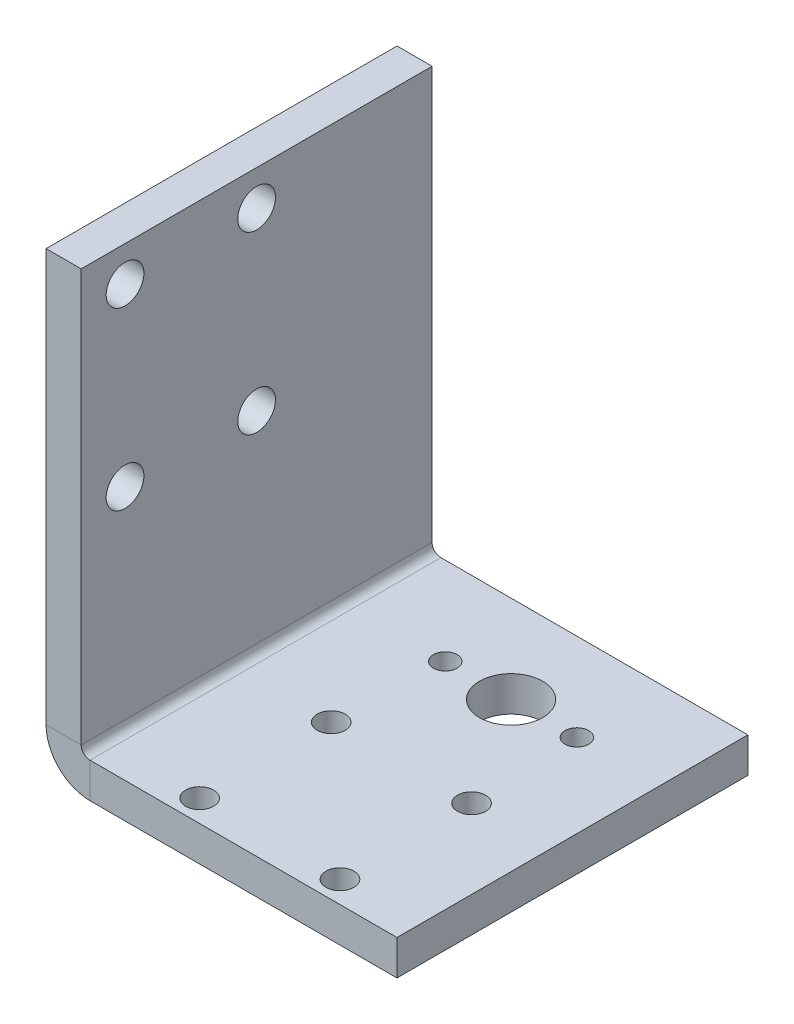
ISO-10303-21;
HEADER;
FILE_DESCRIPTION(('STEP AP214'),'2;1');
FILE_NAME('part.step','',(''),(''),'','','');
FILE_SCHEMA(('AUTOMOTIVE_DESIGN { 1 0 10303 214 1 1 1 1 }'));
ENDSEC;
DATA;
#1=APPLICATION_CONTEXT('core data for automotive mechanical design processes');
#2=APPLICATION_PROTOCOL_DEFINITION('international standard','automotive_design',2000,#1);
#3=PRODUCT_CONTEXT('',#1,'mechanical');
#4=PRODUCT('Part','Part','',(#3));
#5=PRODUCT_RELATED_PRODUCT_CATEGORY('part','',(#4));
#6=PRODUCT_DEFINITION_FORMATION('','',#4);
#7=PRODUCT_DEFINITION_CONTEXT('part definition',#1,'design');
#8=PRODUCT_DEFINITION('design','',#6,#7);
#9=PRODUCT_DEFINITION_SHAPE('','',#8);
#10=(LENGTH_UNIT() NAMED_UNIT(*) SI_UNIT(.MILLI.,.METRE.));
#11=(NAMED_UNIT(*) PLANE_ANGLE_UNIT() SI_UNIT($,.RADIAN.));
#12=(NAMED_UNIT(*) SI_UNIT($,.STERADIAN.) SOLID_ANGLE_UNIT());
#13=UNCERTAINTY_MEASURE_WITH_UNIT(LENGTH_MEASURE(1.E-05),#10,'distance_accuracy_value','');
#14=(GEOMETRIC_REPRESENTATION_CONTEXT(3) GLOBAL_UNCERTAINTY_ASSIGNED_CONTEXT((#13)) GLOBAL_UNIT_ASSIGNED_CONTEXT((#10,
#11,#12)) REPRESENTATION_CONTEXT('',''));
#15=CARTESIAN_POINT('',(0.,0.,0.));
#16=DIRECTION('',(0.,0.,1.));
#17=DIRECTION('',(1.,0.,0.));
#18=AXIS2_PLACEMENT_3D('',#15,#16,#17);
#19=CARTESIAN_POINT('',(1.,0.,20.));
#20=DIRECTION('',(0.,0.,1.));
#21=DIRECTION('',(1.,0.,0.));
#22=AXIS2_PLACEMENT_3D('',#19,#20,#21);
#23=PLANE('',#22);
#24=DIRECTION('',(0.,-1.,0.));
#25=VECTOR('',#24,1.);
#26=CARTESIAN_POINT('',(1.,0.,20.));
#27=LINE('',#26,#25);
#28=CARTESIAN_POINT('',(1.,0.,20.));
#29=VERTEX_POINT('',#28);
#30=CARTESIAN_POINT('',(1.,-4.,20.));
#31=VERTEX_POINT('',#30);
#32=EDGE_CURVE('E11',#29,#31,#27,.T.);
#33=ORIENTED_EDGE('',*,*,#32,.F.);
#34=CARTESIAN_POINT('',(1.,1.,20.));
#35=DIRECTION('',(0.,0.,-1.));
#36=DIRECTION('',(-1.,0.,0.));
#37=AXIS2_PLACEMENT_3D('',#34,#35,#36);
#38=CIRCLE('',#37,1.);
#39=CARTESIAN_POINT('',(0.,1.,20.));
#40=VERTEX_POINT('',#39);
#41=EDGE_CURVE('E137',#40,#29,#38,.F.);
#42=ORIENTED_EDGE('',*,*,#41,.F.);
#43=DIRECTION('',(1.,0.,0.));
#44=VECTOR('',#43,1.);
#45=CARTESIAN_POINT('',(-4.,1.,20.));
#46=LINE('',#45,#44);
#47=CARTESIAN_POINT('',(-4.,1.,20.));
#48=VERTEX_POINT('',#47);
#49=EDGE_CURVE('E48',#48,#40,#46,.T.);
#50=ORIENTED_EDGE('',*,*,#49,.F.);
#51=CARTESIAN_POINT('',(1.,1.,20.));
#52=DIRECTION('',(0.,0.,1.));
#53=DIRECTION('',(1.,0.,0.));
#54=AXIS2_PLACEMENT_3D('',#51,#52,#53);
#55=CIRCLE('',#54,5.);
#56=EDGE_CURVE('E130',#48,#31,#55,.T.);
#57=ORIENTED_EDGE('',*,*,#56,.T.);
#58=EDGE_LOOP('',(#33,#42,#50,#57));
#59=FACE_BOUND('',#58,.T.);
#60=ADVANCED_FACE('F39',(#59),#23,.T.);
#61=CARTESIAN_POINT('',(-4.,1.,20.));
#62=DIRECTION('',(0.,0.,1.));
#63=DIRECTION('',(1.,0.,0.));
#64=AXIS2_PLACEMENT_3D('',#61,#62,#63);
#65=PLANE('',#64);
#66=DIRECTION('',(1.,0.,0.));
#67=VECTOR('',#66,1.);
#68=CARTESIAN_POINT('',(0.,0.,20.));
#69=LINE('',#68,#67);
#70=CARTESIAN_POINT('',(36.,0.,20.));
#71=VERTEX_POINT('',#70);
#72=EDGE_CURVE('E188',#29,#71,#69,.T.);
#73=ORIENTED_EDGE('',*,*,#72,.F.);
#74=ORIENTED_EDGE('',*,*,#32,.T.);
#75=DIRECTION('',(1.,0.,0.));
#76=VECTOR('',#75,1.);
#77=CARTESIAN_POINT('',(0.,-4.,20.));
#78=LINE('',#77,#76);
#79=CARTESIAN_POINT('',(36.,-4.,20.));
#80=VERTEX_POINT('',#79);
#81=EDGE_CURVE('E96',#31,#80,#78,.T.);
#82=ORIENTED_EDGE('',*,*,#81,.T.);
#83=DIRECTION('',(0.,-1.,0.));
#84=VECTOR('',#83,1.);
#85=CARTESIAN_POINT('',(36.,0.,20.));
#86=LINE('',#85,#84);
#87=EDGE_CURVE('E505',#71,#80,#86,.T.);
#88=ORIENTED_EDGE('',*,*,#87,.F.);
#89=EDGE_LOOP('',(#73,#74,#82,#88));
#90=FACE_BOUND('',#89,.T.);
#91=ADVANCED_FACE('F196',(#90),#65,.T.);
#92=CARTESIAN_POINT('',(0.,1.,-20.));
#93=DIRECTION('',(0.,0.,-1.));
#94=DIRECTION('',(-1.,0.,0.));
#95=AXIS2_PLACEMENT_3D('',#92,#93,#94);
#96=PLANE('',#95);
#97=DIRECTION('',(-1.,0.,0.));
#98=VECTOR('',#97,1.);
#99=CARTESIAN_POINT('',(0.,1.,-20.));
#100=LINE('',#99,#98);
#101=CARTESIAN_POINT('',(0.,1.,-20.));
#102=VERTEX_POINT('',#101);
#103=CARTESIAN_POINT('',(-4.,1.,-20.));
#104=VERTEX_POINT('',#103);
#105=EDGE_CURVE('E83',#102,#104,#100,.T.);
#106=ORIENTED_EDGE('',*,*,#105,.F.);
#107=CARTESIAN_POINT('',(1.,1.,-20.));
#108=DIRECTION('',(0.,0.,-1.));
#109=DIRECTION('',(-1.,0.,0.));
#110=AXIS2_PLACEMENT_3D('',#107,#108,#109);
#111=CIRCLE('',#110,1.);
#112=CARTESIAN_POINT('',(1.,0.,-20.));
#113=VERTEX_POINT('',#112);
#114=EDGE_CURVE('E153',#102,#113,#111,.F.);
#115=ORIENTED_EDGE('',*,*,#114,.T.);
#116=DIRECTION('',(0.,1.,0.));
#117=VECTOR('',#116,1.);
#118=CARTESIAN_POINT('',(1.,-4.,-20.));
#119=LINE('',#118,#117);
#120=CARTESIAN_POINT('',(1.,-4.,-20.));
#121=VERTEX_POINT('',#120);
#122=EDGE_CURVE('E90',#121,#113,#119,.T.);
#123=ORIENTED_EDGE('',*,*,#122,.F.);
#124=CARTESIAN_POINT('',(1.,1.,-20.));
#125=DIRECTION('',(0.,0.,1.));
#126=DIRECTION('',(1.,0.,0.));
#127=AXIS2_PLACEMENT_3D('',#124,#125,#126);
#128=CIRCLE('',#127,5.);
#129=EDGE_CURVE('E160',#104,#121,#128,.T.);
#130=ORIENTED_EDGE('',*,*,#129,.F.);
#131=EDGE_LOOP('',(#106,#115,#123,#130));
#132=FACE_BOUND('',#131,.T.);
#133=ADVANCED_FACE('F194',(#132),#96,.T.);
#134=CARTESIAN_POINT('',(1.,-4.,-20.));
#135=DIRECTION('',(0.,0.,-1.));
#136=DIRECTION('',(-1.,0.,0.));
#137=AXIS2_PLACEMENT_3D('',#134,#135,#136);
#138=PLANE('',#137);
#139=DIRECTION('',(0.,-1.,0.));
#140=VECTOR('',#139,1.);
#141=CARTESIAN_POINT('',(0.,0.,-20.));
#142=LINE('',#141,#140);
#143=CARTESIAN_POINT('',(0.,48.,-20.));
#144=VERTEX_POINT('',#143);
#145=EDGE_CURVE('E155',#144,#102,#142,.T.);
#146=ORIENTED_EDGE('',*,*,#145,.T.);
#147=ORIENTED_EDGE('',*,*,#105,.T.);
#148=DIRECTION('',(0.,1.,0.));
#149=VECTOR('',#148,1.);
#150=CARTESIAN_POINT('',(-4.,0.,-20.));
#151=LINE('',#150,#149);
#152=CARTESIAN_POINT('',(-4.,48.,-20.));
#153=VERTEX_POINT('',#152);
#154=EDGE_CURVE('E158',#153,#104,#151,.F.);
#155=ORIENTED_EDGE('',*,*,#154,.F.);
#156=DIRECTION('',(1.,0.,0.));
#157=VECTOR('',#156,1.);
#158=CARTESIAN_POINT('',(-4.,48.,-20.));
#159=LINE('',#158,#157);
#160=EDGE_CURVE('E118',#153,#144,#159,.T.);
#161=ORIENTED_EDGE('',*,*,#160,.T.);
#162=EDGE_LOOP('',(#146,#147,#155,#161));
#163=FACE_BOUND('',#162,.T.);
#164=ADVANCED_FACE('F190',(#163),#138,.T.);
#165=CARTESIAN_POINT('',(0.,-4.,20.));
#166=DIRECTION('',(0.,1.,0.));
#167=DIRECTION('',(0.,0.,1.));
#168=AXIS2_PLACEMENT_3D('',#165,#166,#167);
#169=PLANE('',#168);
#170=CARTESIAN_POINT('',(11.5,-4.,-10.));
#171=DIRECTION('',(0.,-1.,0.));
#172=DIRECTION('',(0.,0.,-1.));
#173=AXIS2_PLACEMENT_3D('',#170,#171,#172);
#174=CIRCLE('',#173,1.35);
#175=CARTESIAN_POINT('',(11.5,-4.,-11.35));
#176=VERTEX_POINT('',#175);
#177=EDGE_CURVE('E444',#176,#176,#174,.T.);
#178=ORIENTED_EDGE('',*,*,#177,.F.);
#179=EDGE_LOOP('',(#178));
#180=FACE_BOUND('',#179,.T.);
#181=CARTESIAN_POINT('',(26.5,-4.,-10.));
#182=DIRECTION('',(0.,-1.,0.));
#183=DIRECTION('',(0.,0.,-1.));
#184=AXIS2_PLACEMENT_3D('',#181,#182,#183);
#185=CIRCLE('',#184,1.34999999999999);
#186=CARTESIAN_POINT('',(26.5,-4.,-11.35));
#187=VERTEX_POINT('',#186);
#188=EDGE_CURVE('E446',#187,#187,#185,.T.);
#189=ORIENTED_EDGE('',*,*,#188,.F.);
#190=EDGE_LOOP('',(#189));
#191=FACE_BOUND('',#190,.T.);
#192=CARTESIAN_POINT('',(19.,-4.,-10.));
#193=DIRECTION('',(0.,-1.,0.));
#194=DIRECTION('',(0.,0.,-1.));
#195=AXIS2_PLACEMENT_3D('',#192,#193,#194);
#196=CIRCLE('',#195,3.6);
#197=CARTESIAN_POINT('',(19.,-4.,-13.6));
#198=VERTEX_POINT('',#197);
#199=EDGE_CURVE('E478',#198,#198,#196,.T.);
#200=ORIENTED_EDGE('',*,*,#199,.F.);
#201=EDGE_LOOP('',(#200));
#202=FACE_BOUND('',#201,.T.);
#203=CARTESIAN_POINT('',(27.,-4.,17.5));
#204=DIRECTION('',(0.,1.,0.));
#205=DIRECTION('',(0.,0.,1.));
#206=AXIS2_PLACEMENT_3D('',#203,#204,#205);
#207=CIRCLE('',#206,1.59999999999999);
#208=CARTESIAN_POINT('',(27.,-4.,19.1));
#209=VERTEX_POINT('',#208);
#210=EDGE_CURVE('E484',#209,#209,#207,.T.);
#211=ORIENTED_EDGE('',*,*,#210,.T.);
#212=EDGE_LOOP('',(#211));
#213=FACE_BOUND('',#212,.T.);
#214=CARTESIAN_POINT('',(11.,-4.,2.5));
#215=DIRECTION('',(0.,1.,0.));
#216=DIRECTION('',(0.,0.,1.));
#217=AXIS2_PLACEMENT_3D('',#214,#215,#216);
#218=CIRCLE('',#217,1.59999999999999);
#219=CARTESIAN_POINT('',(11.,-4.,4.09999999999999));
#220=VERTEX_POINT('',#219);
#221=EDGE_CURVE('E490',#220,#220,#218,.T.);
#222=ORIENTED_EDGE('',*,*,#221,.T.);
#223=EDGE_LOOP('',(#222));
#224=FACE_BOUND('',#223,.T.);
#225=CARTESIAN_POINT('',(11.,-4.,17.5));
#226=DIRECTION('',(0.,1.,0.));
#227=DIRECTION('',(0.,0.,1.));
#228=AXIS2_PLACEMENT_3D('',#225,#226,#227);
#229=CIRCLE('',#228,1.59999999999999);
#230=CARTESIAN_POINT('',(11.,-4.,19.1));
#231=VERTEX_POINT('',#230);
#232=EDGE_CURVE('E496',#231,#231,#229,.T.);
#233=ORIENTED_EDGE('',*,*,#232,.T.);
#234=EDGE_LOOP('',(#233));
#235=FACE_BOUND('',#234,.T.);
#236=CARTESIAN_POINT('',(27.,-4.,2.5));
#237=DIRECTION('',(0.,1.,0.));
#238=DIRECTION('',(0.,0.,1.));
#239=AXIS2_PLACEMENT_3D('',#236,#237,#238);
#240=CIRCLE('',#239,1.59999999999999);
#241=CARTESIAN_POINT('',(27.,-4.,4.09999999999999));
#242=VERTEX_POINT('',#241);
#243=EDGE_CURVE('E147',#242,#242,#240,.T.);
#244=ORIENTED_EDGE('',*,*,#243,.T.);
#245=EDGE_LOOP('',(#244));
#246=FACE_BOUND('',#245,.T.);
#247=DIRECTION('',(1.,0.,0.));
#248=VECTOR('',#247,1.);
#249=CARTESIAN_POINT('',(0.,-4.,-20.));
#250=LINE('',#249,#248);
#251=CARTESIAN_POINT('',(36.,-4.,-20.));
#252=VERTEX_POINT('',#251);
#253=EDGE_CURVE('E143',#121,#252,#250,.T.);
#254=ORIENTED_EDGE('',*,*,#253,.T.);
#255=DIRECTION('',(0.,0.,-1.));
#256=VECTOR('',#255,1.);
#257=CARTESIAN_POINT('',(36.,-4.,20.));
#258=LINE('',#257,#256);
#259=EDGE_CURVE('E174',#80,#252,#258,.T.);
#260=ORIENTED_EDGE('',*,*,#259,.F.);
#261=ORIENTED_EDGE('',*,*,#81,.F.);
#262=DIRECTION('',(0.,0.,-1.));
#263=VECTOR('',#262,1.);
#264=CARTESIAN_POINT('',(1.,-4.,20.));
#265=LINE('',#264,#263);
#266=EDGE_CURVE('E142',#31,#121,#265,.T.);
#267=ORIENTED_EDGE('',*,*,#266,.T.);
#268=EDGE_LOOP('',(#254,#260,#261,#267));
#269=FACE_BOUND('',#268,.T.);
#270=ADVANCED_FACE('F202',(#180,#191,#202,#213,#224,#235,#246,#269),#169,.F.);
#271=CARTESIAN_POINT('',(36.,0.,20.));
#272=DIRECTION('',(1.,0.,0.));
#273=DIRECTION('',(0.,0.,-1.));
#274=AXIS2_PLACEMENT_3D('',#271,#272,#273);
#275=PLANE('',#274);
#276=DIRECTION('',(0.,-1.,0.));
#277=VECTOR('',#276,1.);
#278=CARTESIAN_POINT('',(36.,0.,-20.));
#279=LINE('',#278,#277);
#280=CARTESIAN_POINT('',(36.,0.,-20.));
#281=VERTEX_POINT('',#280);
#282=EDGE_CURVE('E146',#281,#252,#279,.T.);
#283=ORIENTED_EDGE('',*,*,#282,.F.);
#284=DIRECTION('',(0.,0.,-1.));
#285=VECTOR('',#284,1.);
#286=CARTESIAN_POINT('',(36.,0.,20.));
#287=LINE('',#286,#285);
#288=EDGE_CURVE('E172',#71,#281,#287,.T.);
#289=ORIENTED_EDGE('',*,*,#288,.F.);
#290=ORIENTED_EDGE('',*,*,#87,.T.);
#291=ORIENTED_EDGE('',*,*,#259,.T.);
#292=EDGE_LOOP('',(#283,#289,#290,#291));
#293=FACE_BOUND('',#292,.T.);
#294=ADVANCED_FACE('F231',(#293),#275,.T.);
#295=CARTESIAN_POINT('',(0.,0.,20.));
#296=DIRECTION('',(0.,1.,0.));
#297=DIRECTION('',(0.,0.,1.));
#298=AXIS2_PLACEMENT_3D('',#295,#296,#297);
#299=PLANE('',#298);
#300=CARTESIAN_POINT('',(11.5,0.,-10.));
#301=DIRECTION('',(0.,1.,0.));
#302=DIRECTION('',(0.,0.,1.));
#303=AXIS2_PLACEMENT_3D('',#300,#301,#302);
#304=CIRCLE('',#303,1.34999999999999);
#305=CARTESIAN_POINT('',(11.5,0.,-8.65000000000001));
#306=VERTEX_POINT('',#305);
#307=EDGE_CURVE('E441',#306,#306,#304,.T.);
#308=ORIENTED_EDGE('',*,*,#307,.F.);
#309=EDGE_LOOP('',(#308));
#310=FACE_BOUND('',#309,.T.);
#311=CARTESIAN_POINT('',(26.5,0.,-10.));
#312=DIRECTION('',(0.,1.,0.));
#313=DIRECTION('',(0.,0.,1.));
#314=AXIS2_PLACEMENT_3D('',#311,#312,#313);
#315=CIRCLE('',#314,1.34999999999999);
#316=CARTESIAN_POINT('',(26.5,0.,-8.65000000000001));
#317=VERTEX_POINT('',#316);
#318=EDGE_CURVE('E451',#317,#317,#315,.T.);
#319=ORIENTED_EDGE('',*,*,#318,.F.);
#320=EDGE_LOOP('',(#319));
#321=FACE_BOUND('',#320,.T.);
#322=CARTESIAN_POINT('',(19.,0.,-10.));
#323=DIRECTION('',(0.,1.,0.));
#324=DIRECTION('',(0.,0.,1.));
#325=AXIS2_PLACEMENT_3D('',#322,#323,#324);
#326=CIRCLE('',#325,3.6);
#327=CARTESIAN_POINT('',(19.,0.,-6.4));
#328=VERTEX_POINT('',#327);
#329=EDGE_CURVE('E42',#328,#328,#326,.T.);
#330=ORIENTED_EDGE('',*,*,#329,.F.);
#331=EDGE_LOOP('',(#330));
#332=FACE_BOUND('',#331,.T.);
#333=CARTESIAN_POINT('',(27.,0.,17.5));
#334=DIRECTION('',(0.,1.,0.));
#335=DIRECTION('',(0.,0.,1.));
#336=AXIS2_PLACEMENT_3D('',#333,#334,#335);
#337=CIRCLE('',#336,1.59999999999999);
#338=CARTESIAN_POINT('',(27.,0.,19.1));
#339=VERTEX_POINT('',#338);
#340=EDGE_CURVE('E481',#339,#339,#337,.T.);
#341=ORIENTED_EDGE('',*,*,#340,.F.);
#342=EDGE_LOOP('',(#341));
#343=FACE_BOUND('',#342,.T.);
#344=CARTESIAN_POINT('',(11.,0.,2.5));
#345=DIRECTION('',(0.,1.,0.));
#346=DIRECTION('',(0.,0.,1.));
#347=AXIS2_PLACEMENT_3D('',#344,#345,#346);
#348=CIRCLE('',#347,1.59999999999999);
#349=CARTESIAN_POINT('',(11.,0.,4.09999999999998));
#350=VERTEX_POINT('',#349);
#351=EDGE_CURVE('E487',#350,#350,#348,.T.);
#352=ORIENTED_EDGE('',*,*,#351,.F.);
#353=EDGE_LOOP('',(#352));
#354=FACE_BOUND('',#353,.T.);
#355=CARTESIAN_POINT('',(11.,0.,17.5));
#356=DIRECTION('',(0.,1.,0.));
#357=DIRECTION('',(0.,0.,1.));
#358=AXIS2_PLACEMENT_3D('',#355,#356,#357);
#359=CIRCLE('',#358,1.59999999999999);
#360=CARTESIAN_POINT('',(11.,0.,19.1));
#361=VERTEX_POINT('',#360);
#362=EDGE_CURVE('E493',#361,#361,#359,.T.);
#363=ORIENTED_EDGE('',*,*,#362,.F.);
#364=EDGE_LOOP('',(#363));
#365=FACE_BOUND('',#364,.T.);
#366=CARTESIAN_POINT('',(27.,0.,2.5));
#367=DIRECTION('',(0.,1.,0.));
#368=DIRECTION('',(0.,0.,1.));
#369=AXIS2_PLACEMENT_3D('',#366,#367,#368);
#370=CIRCLE('',#369,1.59999999999999);
#371=CARTESIAN_POINT('',(27.,0.,4.09999999999999));
#372=VERTEX_POINT('',#371);
#373=EDGE_CURVE('E499',#372,#372,#370,.T.);
#374=ORIENTED_EDGE('',*,*,#373,.F.);
#375=EDGE_LOOP('',(#374));
#376=FACE_BOUND('',#375,.T.);
#377=DIRECTION('',(1.,0.,0.));
#378=VECTOR('',#377,1.);
#379=CARTESIAN_POINT('',(0.,0.,-20.));
#380=LINE('',#379,#378);
#381=EDGE_CURVE('E150',#113,#281,#380,.T.);
#382=ORIENTED_EDGE('',*,*,#381,.F.);
#383=DIRECTION('',(0.,0.,-1.));
#384=VECTOR('',#383,1.);
#385=CARTESIAN_POINT('',(1.,0.,20.));
#386=LINE('',#385,#384);
#387=EDGE_CURVE('E169',#29,#113,#386,.T.);
#388=ORIENTED_EDGE('',*,*,#387,.F.);
#389=ORIENTED_EDGE('',*,*,#72,.T.);
#390=ORIENTED_EDGE('',*,*,#288,.T.);
#391=EDGE_LOOP('',(#382,#388,#389,#390));
#392=FACE_BOUND('',#391,.T.);
#393=ADVANCED_FACE('F236',(#310,#321,#332,#343,#354,#365,#376,#392),#299,.T.);
#394=CARTESIAN_POINT('',(1.,1.,20.));
#395=DIRECTION('',(0.,0.,-1.));
#396=DIRECTION('',(-1.,0.,0.));
#397=AXIS2_PLACEMENT_3D('',#394,#395,#396);
#398=CYLINDRICAL_SURFACE('',#397,1.);
#399=ORIENTED_EDGE('',*,*,#114,.F.);
#400=DIRECTION('',(0.,0.,-1.));
#401=VECTOR('',#400,1.);
#402=CARTESIAN_POINT('',(0.,1.,20.));
#403=LINE('',#402,#401);
#404=EDGE_CURVE('E166',#40,#102,#403,.T.);
#405=ORIENTED_EDGE('',*,*,#404,.F.);
#406=ORIENTED_EDGE('',*,*,#41,.T.);
#407=ORIENTED_EDGE('',*,*,#387,.T.);
#408=EDGE_LOOP('',(#399,#405,#406,#407));
#409=FACE_BOUND('',#408,.T.);
#410=ADVANCED_FACE('F184',(#409),#398,.F.);
#411=CARTESIAN_POINT('',(0.,0.,20.));
#412=DIRECTION('',(1.,0.,0.));
#413=DIRECTION('',(0.,0.,-1.));
#414=AXIS2_PLACEMENT_3D('',#411,#412,#413);
#415=PLANE('',#414);
#416=CARTESIAN_POINT('',(0.,44.,15.));
#417=DIRECTION('',(1.,0.,0.));
#418=DIRECTION('',(0.,0.,-1.));
#419=AXIS2_PLACEMENT_3D('',#416,#417,#418);
#420=CIRCLE('',#419,2.14999999999999);
#421=CARTESIAN_POINT('',(0.,44.,12.85));
#422=VERTEX_POINT('',#421);
#423=EDGE_CURVE('E454',#422,#422,#420,.T.);
#424=ORIENTED_EDGE('',*,*,#423,.F.);
#425=EDGE_LOOP('',(#424));
#426=FACE_BOUND('',#425,.T.);
#427=CARTESIAN_POINT('',(0.,24.,15.));
#428=DIRECTION('',(1.,0.,0.));
#429=DIRECTION('',(0.,0.,-1.));
#430=AXIS2_PLACEMENT_3D('',#427,#428,#429);
#431=CIRCLE('',#430,2.15);
#432=CARTESIAN_POINT('',(0.,24.,12.85));
#433=VERTEX_POINT('',#432);
#434=EDGE_CURVE('E460',#433,#433,#431,.T.);
#435=ORIENTED_EDGE('',*,*,#434,.F.);
#436=EDGE_LOOP('',(#435));
#437=FACE_BOUND('',#436,.T.);
#438=CARTESIAN_POINT('',(0.,24.,0.));
#439=DIRECTION('',(1.,0.,0.));
#440=DIRECTION('',(0.,0.,-1.));
#441=AXIS2_PLACEMENT_3D('',#438,#439,#440);
#442=CIRCLE('',#441,2.15);
#443=CARTESIAN_POINT('',(0.,24.,-2.14999999999999));
#444=VERTEX_POINT('',#443);
#445=EDGE_CURVE('E466',#444,#444,#442,.T.);
#446=ORIENTED_EDGE('',*,*,#445,.F.);
#447=EDGE_LOOP('',(#446));
#448=FACE_BOUND('',#447,.T.);
#449=CARTESIAN_POINT('',(0.,44.,0.));
#450=DIRECTION('',(1.,0.,0.));
#451=DIRECTION('',(0.,0.,-1.));
#452=AXIS2_PLACEMENT_3D('',#449,#450,#451);
#453=CIRCLE('',#452,2.14999999999999);
#454=CARTESIAN_POINT('',(0.,44.,-2.14999999999999));
#455=VERTEX_POINT('',#454);
#456=EDGE_CURVE('E472',#455,#455,#453,.T.);
#457=ORIENTED_EDGE('',*,*,#456,.F.);
#458=EDGE_LOOP('',(#457));
#459=FACE_BOUND('',#458,.T.);
#460=ORIENTED_EDGE('',*,*,#145,.F.);
#461=DIRECTION('',(0.,0.,-1.));
#462=VECTOR('',#461,1.);
#463=CARTESIAN_POINT('',(0.,48.,20.));
#464=LINE('',#463,#462);
#465=CARTESIAN_POINT('',(0.,48.,20.));
#466=VERTEX_POINT('',#465);
#467=EDGE_CURVE('E120',#466,#144,#464,.T.);
#468=ORIENTED_EDGE('',*,*,#467,.F.);
#469=DIRECTION('',(0.,-1.,0.));
#470=VECTOR('',#469,1.);
#471=CARTESIAN_POINT('',(0.,0.,20.));
#472=LINE('',#471,#470);
#473=EDGE_CURVE('E135',#466,#40,#472,.T.);
#474=ORIENTED_EDGE('',*,*,#473,.T.);
#475=ORIENTED_EDGE('',*,*,#404,.T.);
#476=EDGE_LOOP('',(#460,#468,#474,#475));
#477=FACE_BOUND('',#476,.T.);
#478=ADVANCED_FACE('F189',(#426,#437,#448,#459,#477),#415,.T.);
#479=CARTESIAN_POINT('',(-4.,48.,20.));
#480=DIRECTION('',(0.,1.,0.));
#481=DIRECTION('',(0.,0.,1.));
#482=AXIS2_PLACEMENT_3D('',#479,#480,#481);
#483=PLANE('',#482);
#484=ORIENTED_EDGE('',*,*,#160,.F.);
#485=DIRECTION('',(0.,0.,-1.));
#486=VECTOR('',#485,1.);
#487=CARTESIAN_POINT('',(-4.,48.,20.));
#488=LINE('',#487,#486);
#489=CARTESIAN_POINT('',(-4.,48.,20.));
#490=VERTEX_POINT('',#489);
#491=EDGE_CURVE('E112',#490,#153,#488,.T.);
#492=ORIENTED_EDGE('',*,*,#491,.F.);
#493=DIRECTION('',(1.,0.,0.));
#494=VECTOR('',#493,1.);
#495=CARTESIAN_POINT('',(-4.,48.,20.));
#496=LINE('',#495,#494);
#497=EDGE_CURVE('E116',#490,#466,#496,.T.);
#498=ORIENTED_EDGE('',*,*,#497,.T.);
#499=ORIENTED_EDGE('',*,*,#467,.T.);
#500=EDGE_LOOP('',(#484,#492,#498,#499));
#501=FACE_BOUND('',#500,.T.);
#502=ADVANCED_FACE('F114',(#501),#483,.T.);
#503=CARTESIAN_POINT('',(-4.,0.,20.));
#504=DIRECTION('',(1.,0.,0.));
#505=DIRECTION('',(0.,0.,-1.));
#506=AXIS2_PLACEMENT_3D('',#503,#504,#505);
#507=PLANE('',#506);
#508=CARTESIAN_POINT('',(-4.,44.,15.));
#509=DIRECTION('',(1.,0.,0.));
#510=DIRECTION('',(0.,0.,-1.));
#511=AXIS2_PLACEMENT_3D('',#508,#509,#510);
#512=CIRCLE('',#511,2.14999999999999);
#513=CARTESIAN_POINT('',(-4.,44.,12.85));
#514=VERTEX_POINT('',#513);
#515=EDGE_CURVE('E457',#514,#514,#512,.T.);
#516=ORIENTED_EDGE('',*,*,#515,.T.);
#517=EDGE_LOOP('',(#516));
#518=FACE_BOUND('',#517,.T.);
#519=CARTESIAN_POINT('',(-4.,24.,15.));
#520=DIRECTION('',(1.,0.,0.));
#521=DIRECTION('',(0.,0.,-1.));
#522=AXIS2_PLACEMENT_3D('',#519,#520,#521);
#523=CIRCLE('',#522,2.15);
#524=CARTESIAN_POINT('',(-4.,24.,12.85));
#525=VERTEX_POINT('',#524);
#526=EDGE_CURVE('E463',#525,#525,#523,.T.);
#527=ORIENTED_EDGE('',*,*,#526,.T.);
#528=EDGE_LOOP('',(#527));
#529=FACE_BOUND('',#528,.T.);
#530=CARTESIAN_POINT('',(-4.,24.,0.));
#531=DIRECTION('',(1.,0.,0.));
#532=DIRECTION('',(0.,0.,-1.));
#533=AXIS2_PLACEMENT_3D('',#530,#531,#532);
#534=CIRCLE('',#533,2.15);
#535=CARTESIAN_POINT('',(-4.,24.,-2.14999999999999));
#536=VERTEX_POINT('',#535);
#537=EDGE_CURVE('E469',#536,#536,#534,.T.);
#538=ORIENTED_EDGE('',*,*,#537,.T.);
#539=EDGE_LOOP('',(#538));
#540=FACE_BOUND('',#539,.T.);
#541=CARTESIAN_POINT('',(-4.,44.,0.));
#542=DIRECTION('',(1.,0.,0.));
#543=DIRECTION('',(0.,0.,-1.));
#544=AXIS2_PLACEMENT_3D('',#541,#542,#543);
#545=CIRCLE('',#544,2.14999999999999);
#546=CARTESIAN_POINT('',(-4.,44.,-2.14999999999999));
#547=VERTEX_POINT('',#546);
#548=EDGE_CURVE('E475',#547,#547,#545,.T.);
#549=ORIENTED_EDGE('',*,*,#548,.T.);
#550=EDGE_LOOP('',(#549));
#551=FACE_BOUND('',#550,.T.);
#552=ORIENTED_EDGE('',*,*,#154,.T.);
#553=DIRECTION('',(0.,0.,-1.));
#554=VECTOR('',#553,1.);
#555=CARTESIAN_POINT('',(-4.,1.,20.));
#556=LINE('',#555,#554);
#557=EDGE_CURVE('E121',#48,#104,#556,.T.);
#558=ORIENTED_EDGE('',*,*,#557,.F.);
#559=DIRECTION('',(0.,1.,0.));
#560=VECTOR('',#559,1.);
#561=CARTESIAN_POINT('',(-4.,0.,20.));
#562=LINE('',#561,#560);
#563=EDGE_CURVE('E125',#490,#48,#562,.F.);
#564=ORIENTED_EDGE('',*,*,#563,.F.);
#565=ORIENTED_EDGE('',*,*,#491,.T.);
#566=EDGE_LOOP('',(#552,#558,#564,#565));
#567=FACE_BOUND('',#566,.T.);
#568=ADVANCED_FACE('F126',(#518,#529,#540,#551,#567),#507,.F.);
#569=CARTESIAN_POINT('',(1.,1.,20.));
#570=DIRECTION('',(0.,0.,-1.));
#571=DIRECTION('',(-1.,0.,0.));
#572=AXIS2_PLACEMENT_3D('',#569,#570,#571);
#573=CYLINDRICAL_SURFACE('',#572,5.);
#574=ORIENTED_EDGE('',*,*,#129,.T.);
#575=ORIENTED_EDGE('',*,*,#266,.F.);
#576=ORIENTED_EDGE('',*,*,#56,.F.);
#577=ORIENTED_EDGE('',*,*,#557,.T.);
#578=EDGE_LOOP('',(#574,#575,#576,#577));
#579=FACE_BOUND('',#578,.T.);
#580=ADVANCED_FACE('F192',(#579),#573,.T.);
#581=CARTESIAN_POINT('',(1.,1.,20.));
#582=DIRECTION('',(0.,0.,-1.));
#583=DIRECTION('',(-1.,0.,0.));
#584=AXIS2_PLACEMENT_3D('',#581,#582,#583);
#585=PLANE('',#584);
#586=ORIENTED_EDGE('',*,*,#563,.T.);
#587=ORIENTED_EDGE('',*,*,#49,.T.);
#588=ORIENTED_EDGE('',*,*,#473,.F.);
#589=ORIENTED_EDGE('',*,*,#497,.F.);
#590=EDGE_LOOP('',(#586,#587,#588,#589));
#591=FACE_BOUND('',#590,.T.);
#592=ADVANCED_FACE('F133',(#591),#585,.F.);
#593=CARTESIAN_POINT('',(1.,1.,-20.));
#594=DIRECTION('',(0.,0.,-1.));
#595=DIRECTION('',(-1.,0.,0.));
#596=AXIS2_PLACEMENT_3D('',#593,#594,#595);
#597=PLANE('',#596);
#598=ORIENTED_EDGE('',*,*,#253,.F.);
#599=ORIENTED_EDGE('',*,*,#122,.T.);
#600=ORIENTED_EDGE('',*,*,#381,.T.);
#601=ORIENTED_EDGE('',*,*,#282,.T.);
#602=EDGE_LOOP('',(#598,#599,#600,#601));
#603=FACE_BOUND('',#602,.T.);
#604=ADVANCED_FACE('F280',(#603),#597,.T.);
#605=CARTESIAN_POINT('',(27.,0.,2.5));
#606=DIRECTION('',(0.,1.,0.));
#607=DIRECTION('',(0.,0.,1.));
#608=AXIS2_PLACEMENT_3D('',#605,#606,#607);
#609=CYLINDRICAL_SURFACE('',#608,1.59999999999999);
#610=ORIENTED_EDGE('',*,*,#243,.F.);
#611=EDGE_LOOP('',(#610));
#612=FACE_BOUND('',#611,.T.);
#613=ORIENTED_EDGE('',*,*,#373,.T.);
#614=EDGE_LOOP('',(#613));
#615=FACE_BOUND('',#614,.T.);
#616=ADVANCED_FACE('F290',(#612,#615),#609,.F.);
#617=CARTESIAN_POINT('',(11.,0.,17.5));
#618=DIRECTION('',(0.,1.,0.));
#619=DIRECTION('',(0.,0.,1.));
#620=AXIS2_PLACEMENT_3D('',#617,#618,#619);
#621=CYLINDRICAL_SURFACE('',#620,1.59999999999999);
#622=ORIENTED_EDGE('',*,*,#232,.F.);
#623=EDGE_LOOP('',(#622));
#624=FACE_BOUND('',#623,.T.);
#625=ORIENTED_EDGE('',*,*,#362,.T.);
#626=EDGE_LOOP('',(#625));
#627=FACE_BOUND('',#626,.T.);
#628=ADVANCED_FACE('F301',(#624,#627),#621,.F.);
#629=CARTESIAN_POINT('',(11.,0.,2.5));
#630=DIRECTION('',(0.,1.,0.));
#631=DIRECTION('',(0.,0.,1.));
#632=AXIS2_PLACEMENT_3D('',#629,#630,#631);
#633=CYLINDRICAL_SURFACE('',#632,1.59999999999999);
#634=ORIENTED_EDGE('',*,*,#221,.F.);
#635=EDGE_LOOP('',(#634));
#636=FACE_BOUND('',#635,.T.);
#637=ORIENTED_EDGE('',*,*,#351,.T.);
#638=EDGE_LOOP('',(#637));
#639=FACE_BOUND('',#638,.T.);
#640=ADVANCED_FACE('F311',(#636,#639),#633,.F.);
#641=CARTESIAN_POINT('',(27.,0.,17.5));
#642=DIRECTION('',(0.,1.,0.));
#643=DIRECTION('',(0.,0.,1.));
#644=AXIS2_PLACEMENT_3D('',#641,#642,#643);
#645=CYLINDRICAL_SURFACE('',#644,1.59999999999999);
#646=ORIENTED_EDGE('',*,*,#210,.F.);
#647=EDGE_LOOP('',(#646));
#648=FACE_BOUND('',#647,.T.);
#649=ORIENTED_EDGE('',*,*,#340,.T.);
#650=EDGE_LOOP('',(#649));
#651=FACE_BOUND('',#650,.T.);
#652=ADVANCED_FACE('F321',(#648,#651),#645,.F.);
#653=CARTESIAN_POINT('',(19.,48.,-10.));
#654=DIRECTION('',(0.,-1.,0.));
#655=DIRECTION('',(0.,0.,-1.));
#656=AXIS2_PLACEMENT_3D('',#653,#654,#655);
#657=CYLINDRICAL_SURFACE('',#656,3.6);
#658=ORIENTED_EDGE('',*,*,#329,.T.);
#659=EDGE_LOOP('',(#658));
#660=FACE_BOUND('',#659,.T.);
#661=ORIENTED_EDGE('',*,*,#199,.T.);
#662=EDGE_LOOP('',(#661));
#663=FACE_BOUND('',#662,.T.);
#664=ADVANCED_FACE('F331',(#660,#663),#657,.F.);
#665=CARTESIAN_POINT('',(0.,44.,0.));
#666=DIRECTION('',(1.,0.,0.));
#667=DIRECTION('',(0.,0.,-1.));
#668=AXIS2_PLACEMENT_3D('',#665,#666,#667);
#669=CYLINDRICAL_SURFACE('',#668,2.14999999999999);
#670=ORIENTED_EDGE('',*,*,#548,.F.);
#671=EDGE_LOOP('',(#670));
#672=FACE_BOUND('',#671,.T.);
#673=ORIENTED_EDGE('',*,*,#456,.T.);
#674=EDGE_LOOP('',(#673));
#675=FACE_BOUND('',#674,.T.);
#676=ADVANCED_FACE('F341',(#672,#675),#669,.F.);
#677=CARTESIAN_POINT('',(0.,24.,0.));
#678=DIRECTION('',(1.,0.,0.));
#679=DIRECTION('',(0.,0.,-1.));
#680=AXIS2_PLACEMENT_3D('',#677,#678,#679);
#681=CYLINDRICAL_SURFACE('',#680,2.15);
#682=ORIENTED_EDGE('',*,*,#537,.F.);
#683=EDGE_LOOP('',(#682));
#684=FACE_BOUND('',#683,.T.);
#685=ORIENTED_EDGE('',*,*,#445,.T.);
#686=EDGE_LOOP('',(#685));
#687=FACE_BOUND('',#686,.T.);
#688=ADVANCED_FACE('F368',(#684,#687),#681,.F.);
#689=CARTESIAN_POINT('',(0.,24.,15.));
#690=DIRECTION('',(1.,0.,0.));
#691=DIRECTION('',(0.,0.,-1.));
#692=AXIS2_PLACEMENT_3D('',#689,#690,#691);
#693=CYLINDRICAL_SURFACE('',#692,2.15);
#694=ORIENTED_EDGE('',*,*,#526,.F.);
#695=EDGE_LOOP('',(#694));
#696=FACE_BOUND('',#695,.T.);
#697=ORIENTED_EDGE('',*,*,#434,.T.);
#698=EDGE_LOOP('',(#697));
#699=FACE_BOUND('',#698,.T.);
#700=ADVANCED_FACE('F378',(#696,#699),#693,.F.);
#701=CARTESIAN_POINT('',(0.,44.,15.));
#702=DIRECTION('',(1.,0.,0.));
#703=DIRECTION('',(0.,0.,-1.));
#704=AXIS2_PLACEMENT_3D('',#701,#702,#703);
#705=CYLINDRICAL_SURFACE('',#704,2.14999999999999);
#706=ORIENTED_EDGE('',*,*,#515,.F.);
#707=EDGE_LOOP('',(#706));
#708=FACE_BOUND('',#707,.T.);
#709=ORIENTED_EDGE('',*,*,#423,.T.);
#710=EDGE_LOOP('',(#709));
#711=FACE_BOUND('',#710,.T.);
#712=ADVANCED_FACE('F388',(#708,#711),#705,.F.);
#713=CARTESIAN_POINT('',(26.5,-4.,-10.));
#714=DIRECTION('',(0.,-1.,0.));
#715=DIRECTION('',(0.,0.,-1.));
#716=AXIS2_PLACEMENT_3D('',#713,#714,#715);
#717=CYLINDRICAL_SURFACE('',#716,1.34999999999999);
#718=ORIENTED_EDGE('',*,*,#318,.T.);
#719=EDGE_LOOP('',(#718));
#720=FACE_BOUND('',#719,.T.);
#721=ORIENTED_EDGE('',*,*,#188,.T.);
#722=EDGE_LOOP('',(#721));
#723=FACE_BOUND('',#722,.T.);
#724=ADVANCED_FACE('F398',(#720,#723),#717,.F.);
#725=CARTESIAN_POINT('',(11.5,-4.,-10.));
#726=DIRECTION('',(0.,-1.,0.));
#727=DIRECTION('',(0.,0.,-1.));
#728=AXIS2_PLACEMENT_3D('',#725,#726,#727);
#729=CYLINDRICAL_SURFACE('',#728,1.34999999999999);
#730=ORIENTED_EDGE('',*,*,#307,.T.);
#731=EDGE_LOOP('',(#730));
#732=FACE_BOUND('',#731,.T.);
#733=ORIENTED_EDGE('',*,*,#177,.T.);
#734=EDGE_LOOP('',(#733));
#735=FACE_BOUND('',#734,.T.);
#736=ADVANCED_FACE('F424',(#732,#735),#729,.F.);
#737=CLOSED_SHELL('',(#60,#91,#133,#164,#270,#294,#393,#410,#478,#502,#568,#580,#592,#604,#616,
#628,#640,#652,#664,#676,#688,#700,#712,#724,#736));
#738=MANIFOLD_SOLID_BREP('B2',#737);
#739=ADVANCED_BREP_SHAPE_REPRESENTATION('',(#18,#738),#14);
#740=SHAPE_DEFINITION_REPRESENTATION(#9,#739);
ENDSEC;
END-ISO-10303-21;
